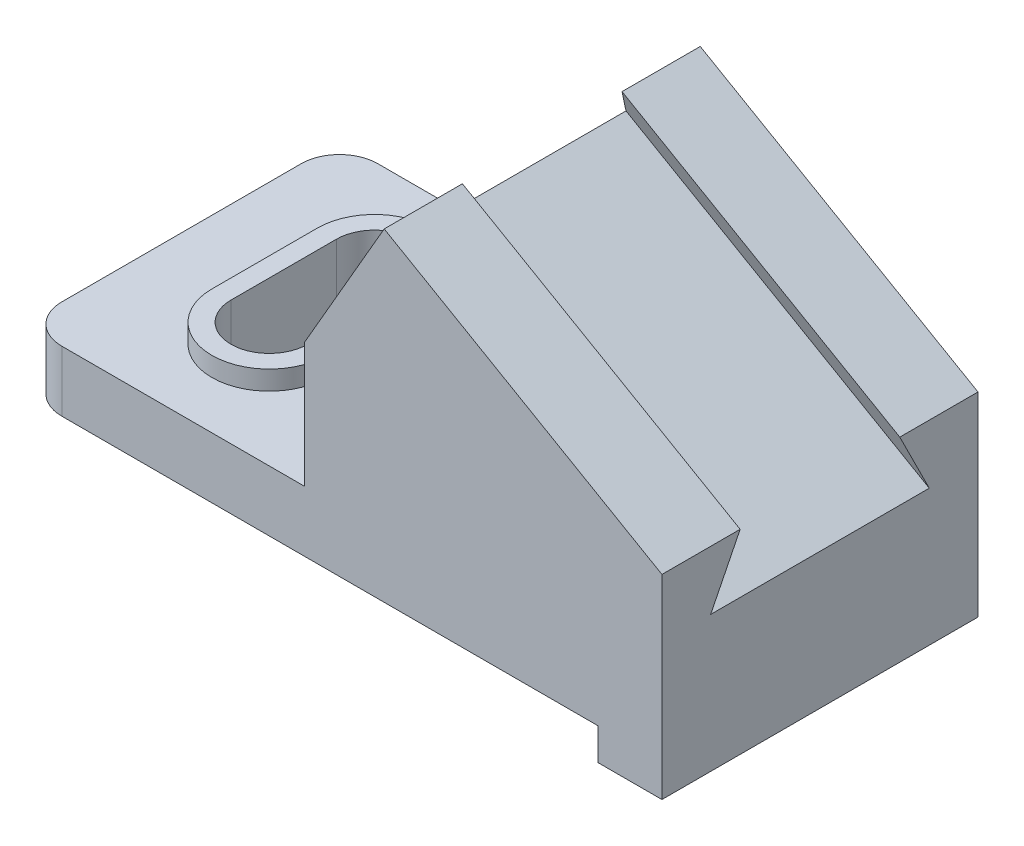
ISO-10303-21;
HEADER;
FILE_DESCRIPTION(('STEP AP214'),'2;1');
FILE_NAME('part.step','',(''),(''),'','','');
FILE_SCHEMA(('AUTOMOTIVE_DESIGN { 1 0 10303 214 1 1 1 1 }'));
ENDSEC;
DATA;
#1=APPLICATION_CONTEXT('core data for automotive mechanical design processes');
#2=APPLICATION_PROTOCOL_DEFINITION('international standard','automotive_design',2000,#1);
#3=PRODUCT_CONTEXT('',#1,'mechanical');
#4=PRODUCT('Part','Part','',(#3));
#5=PRODUCT_RELATED_PRODUCT_CATEGORY('part','',(#4));
#6=PRODUCT_DEFINITION_FORMATION('','',#4);
#7=PRODUCT_DEFINITION_CONTEXT('part definition',#1,'design');
#8=PRODUCT_DEFINITION('design','',#6,#7);
#9=PRODUCT_DEFINITION_SHAPE('','',#8);
#10=(LENGTH_UNIT() NAMED_UNIT(*) SI_UNIT(.MILLI.,.METRE.));
#11=(NAMED_UNIT(*) PLANE_ANGLE_UNIT() SI_UNIT($,.RADIAN.));
#12=(NAMED_UNIT(*) SI_UNIT($,.STERADIAN.) SOLID_ANGLE_UNIT());
#13=UNCERTAINTY_MEASURE_WITH_UNIT(LENGTH_MEASURE(1.E-05),#10,'distance_accuracy_value','');
#14=(GEOMETRIC_REPRESENTATION_CONTEXT(3) GLOBAL_UNCERTAINTY_ASSIGNED_CONTEXT((#13)) GLOBAL_UNIT_ASSIGNED_CONTEXT((#10,
#11,#12)) REPRESENTATION_CONTEXT('',''));
#15=CARTESIAN_POINT('',(0.,0.,0.));
#16=DIRECTION('',(0.,0.,1.));
#17=DIRECTION('',(1.,0.,0.));
#18=AXIS2_PLACEMENT_3D('',#15,#16,#17);
#19=CARTESIAN_POINT('',(56.5,55.6506350946109,24.75));
#20=DIRECTION('',(-0.5,-0.866025403784438,0.));
#21=DIRECTION('',(0.866025403784439,-0.5,0.));
#22=AXIS2_PLACEMENT_3D('',#19,#20,#21);
#23=PLANE('',#22);
#24=DIRECTION('',(0.,0.,-1.));
#25=VECTOR('',#24,1.);
#26=CARTESIAN_POINT('',(56.5,55.6506350946109,24.75));
#27=LINE('',#26,#25);
#28=CARTESIAN_POINT('',(56.5,55.6506350946109,-12.5));
#29=VERTEX_POINT('',#28);
#30=CARTESIAN_POINT('',(56.5,55.6506350946109,-24.75));
#31=VERTEX_POINT('',#30);
#32=EDGE_CURVE('E322',#29,#31,#27,.T.);
#33=ORIENTED_EDGE('',*,*,#32,.F.);
#34=DIRECTION('',(-0.866025403784439,0.5,0.));
#35=VECTOR('',#34,1.);
#36=CARTESIAN_POINT('',(113.222431864335,22.9019237886466,-12.5));
#37=LINE('',#36,#35);
#38=CARTESIAN_POINT('',(100.,30.5358983848622,-12.5));
#39=VERTEX_POINT('',#38);
#40=EDGE_CURVE('E221',#39,#29,#37,.T.);
#41=ORIENTED_EDGE('',*,*,#40,.F.);
#42=DIRECTION('',(0.,0.,-1.));
#43=VECTOR('',#42,1.);
#44=CARTESIAN_POINT('',(100.,30.5358983848622,24.75));
#45=LINE('',#44,#43);
#46=CARTESIAN_POINT('',(100.,30.5358983848622,-24.75));
#47=VERTEX_POINT('',#46);
#48=EDGE_CURVE('E324',#39,#47,#45,.T.);
#49=ORIENTED_EDGE('',*,*,#48,.T.);
#50=DIRECTION('',(-0.866025403784439,0.5,0.));
#51=VECTOR('',#50,1.);
#52=CARTESIAN_POINT('',(56.5,55.6506350946109,-24.75));
#53=LINE('',#52,#51);
#54=EDGE_CURVE('E309',#47,#31,#53,.T.);
#55=ORIENTED_EDGE('',*,*,#54,.T.);
#56=EDGE_LOOP('',(#33,#41,#49,#55));
#57=FACE_BOUND('',#56,.T.);
#58=ADVANCED_FACE('F33',(#57),#23,.F.);
#59=CARTESIAN_POINT('',(6.,14.5,24.75));
#60=DIRECTION('',(0.,-1.,0.));
#61=DIRECTION('',(0.,0.,-1.));
#62=AXIS2_PLACEMENT_3D('',#59,#60,#61);
#63=PLANE('',#62);
#64=DIRECTION('',(-1.,0.,0.));
#65=VECTOR('',#64,1.);
#66=CARTESIAN_POINT('',(6.,14.5,-24.75));
#67=LINE('',#66,#65);
#68=CARTESIAN_POINT('',(44.,14.5,-24.75));
#69=VERTEX_POINT('',#68);
#70=CARTESIAN_POINT('',(6.,14.5,-24.75));
#71=VERTEX_POINT('',#70);
#72=EDGE_CURVE('E284',#69,#71,#67,.T.);
#73=ORIENTED_EDGE('',*,*,#72,.T.);
#74=CARTESIAN_POINT('',(6.,14.5,-18.75));
#75=DIRECTION('',(0.,-1.,0.));
#76=DIRECTION('',(0.,0.,-1.));
#77=AXIS2_PLACEMENT_3D('',#74,#75,#76);
#78=CIRCLE('',#77,6.);
#79=CARTESIAN_POINT('',(0.,14.5,-18.75));
#80=VERTEX_POINT('',#79);
#81=EDGE_CURVE('E41',#71,#80,#78,.F.);
#82=ORIENTED_EDGE('',*,*,#81,.T.);
#83=DIRECTION('',(0.,0.,-1.));
#84=VECTOR('',#83,1.);
#85=CARTESIAN_POINT('',(0.,14.5,24.75));
#86=LINE('',#85,#84);
#87=CARTESIAN_POINT('',(0.,14.5,18.75));
#88=VERTEX_POINT('',#87);
#89=EDGE_CURVE('E340',#88,#80,#86,.T.);
#90=ORIENTED_EDGE('',*,*,#89,.F.);
#91=CARTESIAN_POINT('',(6.,14.5,18.75));
#92=DIRECTION('',(0.,-1.,0.));
#93=DIRECTION('',(0.,0.,-1.));
#94=AXIS2_PLACEMENT_3D('',#91,#92,#93);
#95=CIRCLE('',#94,6.);
#96=CARTESIAN_POINT('',(6.,14.5,24.75));
#97=VERTEX_POINT('',#96);
#98=EDGE_CURVE('E48',#88,#97,#95,.F.);
#99=ORIENTED_EDGE('',*,*,#98,.T.);
#100=DIRECTION('',(-1.,0.,0.));
#101=VECTOR('',#100,1.);
#102=CARTESIAN_POINT('',(0.,14.5,24.75));
#103=LINE('',#102,#101);
#104=CARTESIAN_POINT('',(44.,14.5,24.75));
#105=VERTEX_POINT('',#104);
#106=EDGE_CURVE('E281',#105,#97,#103,.T.);
#107=ORIENTED_EDGE('',*,*,#106,.F.);
#108=DIRECTION('',(0.,0.,-1.));
#109=VECTOR('',#108,1.);
#110=CARTESIAN_POINT('',(44.,14.5,24.75));
#111=LINE('',#110,#109);
#112=EDGE_CURVE('E299',#105,#69,#111,.T.);
#113=ORIENTED_EDGE('',*,*,#112,.T.);
#114=EDGE_LOOP('',(#73,#82,#90,#99,#107,#113));
#115=FACE_BOUND('',#114,.T.);
#116=CARTESIAN_POINT('',(22.,14.5,-8.25));
#117=DIRECTION('',(0.,1.,0.));
#118=DIRECTION('',(0.,0.,1.));
#119=AXIS2_PLACEMENT_3D('',#116,#117,#118);
#120=CIRCLE('',#119,9.);
#121=CARTESIAN_POINT('',(31.,14.5,-8.25));
#122=VERTEX_POINT('',#121);
#123=CARTESIAN_POINT('',(13.,14.5,-8.25));
#124=VERTEX_POINT('',#123);
#125=EDGE_CURVE('E247',#122,#124,#120,.T.);
#126=ORIENTED_EDGE('',*,*,#125,.F.);
#127=DIRECTION('',(0.,0.,-1.));
#128=VECTOR('',#127,1.);
#129=CARTESIAN_POINT('',(31.,14.5,-8.25));
#130=LINE('',#129,#128);
#131=CARTESIAN_POINT('',(31.,14.5,8.25));
#132=VERTEX_POINT('',#131);
#133=EDGE_CURVE('E252',#132,#122,#130,.T.);
#134=ORIENTED_EDGE('',*,*,#133,.F.);
#135=CARTESIAN_POINT('',(22.,14.5,8.25));
#136=DIRECTION('',(0.,1.,0.));
#137=DIRECTION('',(0.,0.,1.));
#138=AXIS2_PLACEMENT_3D('',#135,#136,#137);
#139=CIRCLE('',#138,9.);
#140=CARTESIAN_POINT('',(13.,14.5,8.25));
#141=VERTEX_POINT('',#140);
#142=EDGE_CURVE('E264',#141,#132,#139,.T.);
#143=ORIENTED_EDGE('',*,*,#142,.F.);
#144=DIRECTION('',(0.,0.,1.));
#145=VECTOR('',#144,1.);
#146=CARTESIAN_POINT('',(13.,14.5,-8.25));
#147=LINE('',#146,#145);
#148=EDGE_CURVE('E261',#124,#141,#147,.T.);
#149=ORIENTED_EDGE('',*,*,#148,.F.);
#150=EDGE_LOOP('',(#126,#134,#143,#149));
#151=FACE_BOUND('',#150,.T.);
#152=ADVANCED_FACE('F366',(#115,#151),#63,.F.);
#153=CARTESIAN_POINT('',(0.,5.,24.75));
#154=DIRECTION('',(1.,0.,0.));
#155=DIRECTION('',(0.,0.,-1.));
#156=AXIS2_PLACEMENT_3D('',#153,#154,#155);
#157=PLANE('',#156);
#158=ORIENTED_EDGE('',*,*,#89,.T.);
#159=DIRECTION('',(0.,-1.,0.));
#160=VECTOR('',#159,1.);
#161=CARTESIAN_POINT('',(0.,5.,-18.75));
#162=LINE('',#161,#160);
#163=CARTESIAN_POINT('',(0.,5.,-18.75));
#164=VERTEX_POINT('',#163);
#165=EDGE_CURVE('E357',#80,#164,#162,.T.);
#166=ORIENTED_EDGE('',*,*,#165,.T.);
#167=DIRECTION('',(0.,0.,-1.));
#168=VECTOR('',#167,1.);
#169=CARTESIAN_POINT('',(0.,5.,24.75));
#170=LINE('',#169,#168);
#171=CARTESIAN_POINT('',(0.,5.,18.75));
#172=VERTEX_POINT('',#171);
#173=EDGE_CURVE('E337',#172,#164,#170,.T.);
#174=ORIENTED_EDGE('',*,*,#173,.F.);
#175=DIRECTION('',(0.,-1.,0.));
#176=VECTOR('',#175,1.);
#177=CARTESIAN_POINT('',(0.,14.5,18.75));
#178=LINE('',#177,#176);
#179=EDGE_CURVE('E355',#172,#88,#178,.F.);
#180=ORIENTED_EDGE('',*,*,#179,.T.);
#181=EDGE_LOOP('',(#158,#166,#174,#180));
#182=FACE_BOUND('',#181,.T.);
#183=ADVANCED_FACE('F371',(#182),#157,.F.);
#184=CARTESIAN_POINT('',(90.,5.,24.75));
#185=DIRECTION('',(0.,1.,0.));
#186=DIRECTION('',(0.,0.,1.));
#187=AXIS2_PLACEMENT_3D('',#184,#185,#186);
#188=PLANE('',#187);
#189=DIRECTION('',(0.,0.,1.));
#190=VECTOR('',#189,1.);
#191=CARTESIAN_POINT('',(16.,5.,24.75));
#192=LINE('',#191,#190);
#193=CARTESIAN_POINT('',(16.,5.,-8.25));
#194=VERTEX_POINT('',#193);
#195=CARTESIAN_POINT('',(16.,5.,8.25));
#196=VERTEX_POINT('',#195);
#197=EDGE_CURVE('E349',#194,#196,#192,.T.);
#198=ORIENTED_EDGE('',*,*,#197,.T.);
#199=CARTESIAN_POINT('',(22.,5.,8.25));
#200=DIRECTION('',(0.,1.,0.));
#201=DIRECTION('',(0.,0.,1.));
#202=AXIS2_PLACEMENT_3D('',#199,#200,#201);
#203=CIRCLE('',#202,6.);
#204=CARTESIAN_POINT('',(28.,5.,8.25));
#205=VERTEX_POINT('',#204);
#206=EDGE_CURVE('E352',#196,#205,#203,.T.);
#207=ORIENTED_EDGE('',*,*,#206,.T.);
#208=DIRECTION('',(0.,0.,-1.));
#209=VECTOR('',#208,1.);
#210=CARTESIAN_POINT('',(28.,5.,24.75));
#211=LINE('',#210,#209);
#212=CARTESIAN_POINT('',(28.,5.,-8.25));
#213=VERTEX_POINT('',#212);
#214=EDGE_CURVE('E343',#205,#213,#211,.T.);
#215=ORIENTED_EDGE('',*,*,#214,.T.);
#216=CARTESIAN_POINT('',(22.,5.,-8.25));
#217=DIRECTION('',(0.,1.,0.));
#218=DIRECTION('',(0.,0.,1.));
#219=AXIS2_PLACEMENT_3D('',#216,#217,#218);
#220=CIRCLE('',#219,6.);
#221=EDGE_CURVE('E346',#213,#194,#220,.T.);
#222=ORIENTED_EDGE('',*,*,#221,.T.);
#223=EDGE_LOOP('',(#198,#207,#215,#222));
#224=FACE_BOUND('',#223,.T.);
#225=ORIENTED_EDGE('',*,*,#173,.T.);
#226=CARTESIAN_POINT('',(6.,5.,-18.75));
#227=DIRECTION('',(0.,1.,0.));
#228=DIRECTION('',(0.,0.,1.));
#229=AXIS2_PLACEMENT_3D('',#226,#227,#228);
#230=CIRCLE('',#229,6.);
#231=CARTESIAN_POINT('',(6.00000000000001,5.,-24.75));
#232=VERTEX_POINT('',#231);
#233=EDGE_CURVE('E362',#164,#232,#230,.F.);
#234=ORIENTED_EDGE('',*,*,#233,.T.);
#235=DIRECTION('',(1.,0.,0.));
#236=VECTOR('',#235,1.);
#237=CARTESIAN_POINT('',(90.,5.,-24.75));
#238=LINE('',#237,#236);
#239=CARTESIAN_POINT('',(90.,5.,-24.75));
#240=VERTEX_POINT('',#239);
#241=EDGE_CURVE('E280',#232,#240,#238,.T.);
#242=ORIENTED_EDGE('',*,*,#241,.T.);
#243=DIRECTION('',(0.,0.,-1.));
#244=VECTOR('',#243,1.);
#245=CARTESIAN_POINT('',(90.,5.,24.75));
#246=LINE('',#245,#244);
#247=CARTESIAN_POINT('',(90.,5.,24.75));
#248=VERTEX_POINT('',#247);
#249=EDGE_CURVE('E334',#248,#240,#246,.T.);
#250=ORIENTED_EDGE('',*,*,#249,.F.);
#251=DIRECTION('',(1.,0.,0.));
#252=VECTOR('',#251,1.);
#253=CARTESIAN_POINT('',(6.,5.,24.75));
#254=LINE('',#253,#252);
#255=CARTESIAN_POINT('',(6.,5.,24.75));
#256=VERTEX_POINT('',#255);
#257=EDGE_CURVE('E283',#256,#248,#254,.T.);
#258=ORIENTED_EDGE('',*,*,#257,.F.);
#259=CARTESIAN_POINT('',(6.,5.,18.75));
#260=DIRECTION('',(0.,1.,0.));
#261=DIRECTION('',(0.,0.,1.));
#262=AXIS2_PLACEMENT_3D('',#259,#260,#261);
#263=CIRCLE('',#262,6.);
#264=EDGE_CURVE('E360',#256,#172,#263,.F.);
#265=ORIENTED_EDGE('',*,*,#264,.T.);
#266=EDGE_LOOP('',(#225,#234,#242,#250,#258,#265));
#267=FACE_BOUND('',#266,.T.);
#268=ADVANCED_FACE('F376',(#224,#267),#188,.F.);
#269=CARTESIAN_POINT('',(90.,0.,24.75));
#270=DIRECTION('',(1.,0.,0.));
#271=DIRECTION('',(0.,0.,-1.));
#272=AXIS2_PLACEMENT_3D('',#269,#270,#271);
#273=PLANE('',#272);
#274=DIRECTION('',(0.,-1.,0.));
#275=VECTOR('',#274,1.);
#276=CARTESIAN_POINT('',(90.,0.,-24.75));
#277=LINE('',#276,#275);
#278=CARTESIAN_POINT('',(90.,0.,-24.75));
#279=VERTEX_POINT('',#278);
#280=EDGE_CURVE('E301',#240,#279,#277,.T.);
#281=ORIENTED_EDGE('',*,*,#280,.T.);
#282=DIRECTION('',(0.,0.,-1.));
#283=VECTOR('',#282,1.);
#284=CARTESIAN_POINT('',(90.,0.,24.75));
#285=LINE('',#284,#283);
#286=CARTESIAN_POINT('',(90.,0.,24.75));
#287=VERTEX_POINT('',#286);
#288=EDGE_CURVE('E331',#287,#279,#285,.T.);
#289=ORIENTED_EDGE('',*,*,#288,.F.);
#290=DIRECTION('',(0.,-1.,0.));
#291=VECTOR('',#290,1.);
#292=CARTESIAN_POINT('',(90.,0.,24.75));
#293=LINE('',#292,#291);
#294=EDGE_CURVE('E286',#248,#287,#293,.T.);
#295=ORIENTED_EDGE('',*,*,#294,.F.);
#296=ORIENTED_EDGE('',*,*,#249,.T.);
#297=EDGE_LOOP('',(#281,#289,#295,#296));
#298=FACE_BOUND('',#297,.T.);
#299=ADVANCED_FACE('F383',(#298),#273,.F.);
#300=CARTESIAN_POINT('',(90.,0.,24.75));
#301=DIRECTION('',(0.,1.,0.));
#302=DIRECTION('',(0.,0.,1.));
#303=AXIS2_PLACEMENT_3D('',#300,#301,#302);
#304=PLANE('',#303);
#305=DIRECTION('',(1.,0.,0.));
#306=VECTOR('',#305,1.);
#307=CARTESIAN_POINT('',(90.,0.,-24.75));
#308=LINE('',#307,#306);
#309=CARTESIAN_POINT('',(100.,0.,-24.75));
#310=VERTEX_POINT('',#309);
#311=EDGE_CURVE('E303',#279,#310,#308,.T.);
#312=ORIENTED_EDGE('',*,*,#311,.T.);
#313=DIRECTION('',(0.,0.,-1.));
#314=VECTOR('',#313,1.);
#315=CARTESIAN_POINT('',(100.,0.,24.75));
#316=LINE('',#315,#314);
#317=CARTESIAN_POINT('',(100.,0.,24.75));
#318=VERTEX_POINT('',#317);
#319=EDGE_CURVE('E328',#318,#310,#316,.T.);
#320=ORIENTED_EDGE('',*,*,#319,.F.);
#321=DIRECTION('',(1.,0.,0.));
#322=VECTOR('',#321,1.);
#323=CARTESIAN_POINT('',(90.,0.,24.75));
#324=LINE('',#323,#322);
#325=EDGE_CURVE('E288',#287,#318,#324,.T.);
#326=ORIENTED_EDGE('',*,*,#325,.F.);
#327=ORIENTED_EDGE('',*,*,#288,.T.);
#328=EDGE_LOOP('',(#312,#320,#326,#327));
#329=FACE_BOUND('',#328,.T.);
#330=ADVANCED_FACE('F387',(#329),#304,.F.);
#331=CARTESIAN_POINT('',(100.,30.5358983848622,24.75));
#332=DIRECTION('',(-1.,0.,0.));
#333=DIRECTION('',(0.,0.,1.));
#334=AXIS2_PLACEMENT_3D('',#331,#332,#333);
#335=PLANE('',#334);
#336=ORIENTED_EDGE('',*,*,#48,.F.);
#337=DIRECTION('',(0.,-0.894427190999914,-0.447213595499962));
#338=VECTOR('',#337,1.);
#339=CARTESIAN_POINT('',(100.,45.4358983848623,-5.04999999999988));
#340=LINE('',#339,#338);
#341=CARTESIAN_POINT('',(100.,21.2982940778282,-17.1188021535171));
#342=VERTEX_POINT('',#341);
#343=EDGE_CURVE('E227',#39,#342,#340,.T.);
#344=ORIENTED_EDGE('',*,*,#343,.T.);
#345=DIRECTION('',(0.,0.,1.));
#346=VECTOR('',#345,1.);
#347=CARTESIAN_POINT('',(100.,21.2982940778282,24.75));
#348=LINE('',#347,#346);
#349=CARTESIAN_POINT('',(100.,21.2982940778282,17.118802153517));
#350=VERTEX_POINT('',#349);
#351=EDGE_CURVE('E223',#342,#350,#348,.T.);
#352=ORIENTED_EDGE('',*,*,#351,.T.);
#353=DIRECTION('',(0.,0.894427190999914,-0.447213595499961));
#354=VECTOR('',#353,1.);
#355=CARTESIAN_POINT('',(100.,25.6358983848621,14.95));
#356=LINE('',#355,#354);
#357=CARTESIAN_POINT('',(100.,30.5358983848622,12.5));
#358=VERTEX_POINT('',#357);
#359=EDGE_CURVE('E197',#350,#358,#356,.T.);
#360=ORIENTED_EDGE('',*,*,#359,.T.);
#361=CARTESIAN_POINT('',(100.,30.5358983848622,24.75));
#362=VERTEX_POINT('',#361);
#363=EDGE_CURVE('E325',#362,#358,#45,.T.);
#364=ORIENTED_EDGE('',*,*,#363,.F.);
#365=DIRECTION('',(0.,1.,0.));
#366=VECTOR('',#365,1.);
#367=CARTESIAN_POINT('',(100.,0.,24.75));
#368=LINE('',#367,#366);
#369=EDGE_CURVE('E290',#318,#362,#368,.T.);
#370=ORIENTED_EDGE('',*,*,#369,.F.);
#371=ORIENTED_EDGE('',*,*,#319,.T.);
#372=DIRECTION('',(0.,1.,0.));
#373=VECTOR('',#372,1.);
#374=CARTESIAN_POINT('',(100.,30.5358983848622,-24.75));
#375=LINE('',#374,#373);
#376=EDGE_CURVE('E306',#310,#47,#375,.T.);
#377=ORIENTED_EDGE('',*,*,#376,.T.);
#378=EDGE_LOOP('',(#336,#344,#352,#360,#364,#370,#371,#377));
#379=FACE_BOUND('',#378,.T.);
#380=ADVANCED_FACE('F412',(#379),#335,.F.);
#381=ORIENTED_EDGE('',*,*,#363,.T.);
#382=DIRECTION('',(-0.866025403784439,0.5,0.));
#383=VECTOR('',#382,1.);
#384=CARTESIAN_POINT('',(113.222431864335,22.9019237886466,12.5));
#385=LINE('',#384,#383);
#386=CARTESIAN_POINT('',(56.5,55.6506350946109,12.5));
#387=VERTEX_POINT('',#386);
#388=EDGE_CURVE('E200',#358,#387,#385,.T.);
#389=ORIENTED_EDGE('',*,*,#388,.T.);
#390=CARTESIAN_POINT('',(56.5,55.6506350946109,24.75));
#391=VERTEX_POINT('',#390);
#392=EDGE_CURVE('E216',#391,#387,#27,.T.);
#393=ORIENTED_EDGE('',*,*,#392,.F.);
#394=DIRECTION('',(-0.866025403784439,0.5,0.));
#395=VECTOR('',#394,1.);
#396=CARTESIAN_POINT('',(56.5,55.6506350946109,24.75));
#397=LINE('',#396,#395);
#398=EDGE_CURVE('E292',#362,#391,#397,.T.);
#399=ORIENTED_EDGE('',*,*,#398,.F.);
#400=EDGE_LOOP('',(#381,#389,#393,#399));
#401=FACE_BOUND('',#400,.T.);
#402=ADVANCED_FACE('F403',(#401),#23,.F.);
#403=CARTESIAN_POINT('',(44.,34.,24.75));
#404=DIRECTION('',(0.866025403784439,-0.5,0.));
#405=DIRECTION('',(0.5,0.866025403784439,0.));
#406=AXIS2_PLACEMENT_3D('',#403,#404,#405);
#407=PLANE('',#406);
#408=DIRECTION('',(0.,0.,1.));
#409=VECTOR('',#408,1.);
#410=CARTESIAN_POINT('',(52.5,48.7224318643354,-17.1188021535171));
#411=LINE('',#410,#409);
#412=CARTESIAN_POINT('',(52.5,48.7224318643354,-17.1188021535171));
#413=VERTEX_POINT('',#412);
#414=CARTESIAN_POINT('',(52.5,48.7224318643354,17.118802153517));
#415=VERTEX_POINT('',#414);
#416=EDGE_CURVE('E205',#413,#415,#411,.T.);
#417=ORIENTED_EDGE('',*,*,#416,.F.);
#418=DIRECTION('',(-0.433012701892218,-0.749999999999998,-0.500000000000004));
#419=VECTOR('',#418,1.);
#420=CARTESIAN_POINT('',(56.5,55.6506350946109,-12.5));
#421=LINE('',#420,#419);
#422=EDGE_CURVE('E210',#29,#413,#421,.T.);
#423=ORIENTED_EDGE('',*,*,#422,.F.);
#424=ORIENTED_EDGE('',*,*,#32,.T.);
#425=DIRECTION('',(-0.5,-0.866025403784439,0.));
#426=VECTOR('',#425,1.);
#427=CARTESIAN_POINT('',(44.,34.,-24.75));
#428=LINE('',#427,#426);
#429=CARTESIAN_POINT('',(44.,34.,-24.75));
#430=VERTEX_POINT('',#429);
#431=EDGE_CURVE('E312',#31,#430,#428,.T.);
#432=ORIENTED_EDGE('',*,*,#431,.T.);
#433=DIRECTION('',(0.,0.,-1.));
#434=VECTOR('',#433,1.);
#435=CARTESIAN_POINT('',(44.,34.,24.75));
#436=LINE('',#435,#434);
#437=CARTESIAN_POINT('',(44.,34.,24.75));
#438=VERTEX_POINT('',#437);
#439=EDGE_CURVE('E319',#438,#430,#436,.T.);
#440=ORIENTED_EDGE('',*,*,#439,.F.);
#441=DIRECTION('',(-0.5,-0.866025403784439,0.));
#442=VECTOR('',#441,1.);
#443=CARTESIAN_POINT('',(44.,34.,24.75));
#444=LINE('',#443,#442);
#445=EDGE_CURVE('E294',#391,#438,#444,.T.);
#446=ORIENTED_EDGE('',*,*,#445,.F.);
#447=ORIENTED_EDGE('',*,*,#392,.T.);
#448=DIRECTION('',(0.433012701892218,0.749999999999998,-0.500000000000004));
#449=VECTOR('',#448,1.);
#450=CARTESIAN_POINT('',(56.5,55.6506350946109,12.5));
#451=LINE('',#450,#449);
#452=EDGE_CURVE('E194',#415,#387,#451,.T.);
#453=ORIENTED_EDGE('',*,*,#452,.F.);
#454=EDGE_LOOP('',(#417,#423,#424,#432,#440,#446,#447,#453));
#455=FACE_BOUND('',#454,.T.);
#456=ADVANCED_FACE('F213',(#455),#407,.F.);
#457=CARTESIAN_POINT('',(44.,14.5,24.75));
#458=DIRECTION('',(1.,0.,0.));
#459=DIRECTION('',(0.,0.,-1.));
#460=AXIS2_PLACEMENT_3D('',#457,#458,#459);
#461=PLANE('',#460);
#462=DIRECTION('',(0.,-1.,0.));
#463=VECTOR('',#462,1.);
#464=CARTESIAN_POINT('',(44.,14.5,-24.75));
#465=LINE('',#464,#463);
#466=EDGE_CURVE('E314',#430,#69,#465,.T.);
#467=ORIENTED_EDGE('',*,*,#466,.T.);
#468=ORIENTED_EDGE('',*,*,#112,.F.);
#469=DIRECTION('',(0.,-1.,0.));
#470=VECTOR('',#469,1.);
#471=CARTESIAN_POINT('',(44.,14.5,24.75));
#472=LINE('',#471,#470);
#473=EDGE_CURVE('E296',#438,#105,#472,.T.);
#474=ORIENTED_EDGE('',*,*,#473,.F.);
#475=ORIENTED_EDGE('',*,*,#439,.T.);
#476=EDGE_LOOP('',(#467,#468,#474,#475));
#477=FACE_BOUND('',#476,.T.);
#478=ADVANCED_FACE('F418',(#477),#461,.F.);
#479=CARTESIAN_POINT('',(0.,0.,24.75));
#480=DIRECTION('',(0.,0.,1.));
#481=DIRECTION('',(1.,0.,0.));
#482=AXIS2_PLACEMENT_3D('',#479,#480,#481);
#483=PLANE('',#482);
#484=ORIENTED_EDGE('',*,*,#106,.T.);
#485=DIRECTION('',(0.,-1.,0.));
#486=VECTOR('',#485,1.);
#487=CARTESIAN_POINT('',(6.,5.,24.75));
#488=LINE('',#487,#486);
#489=EDGE_CURVE('E11',#97,#256,#488,.T.);
#490=ORIENTED_EDGE('',*,*,#489,.T.);
#491=ORIENTED_EDGE('',*,*,#257,.T.);
#492=ORIENTED_EDGE('',*,*,#294,.T.);
#493=ORIENTED_EDGE('',*,*,#325,.T.);
#494=ORIENTED_EDGE('',*,*,#369,.T.);
#495=ORIENTED_EDGE('',*,*,#398,.T.);
#496=ORIENTED_EDGE('',*,*,#445,.T.);
#497=ORIENTED_EDGE('',*,*,#473,.T.);
#498=EDGE_LOOP('',(#484,#490,#491,#492,#493,#494,#495,#496,#497));
#499=FACE_BOUND('',#498,.T.);
#500=ADVANCED_FACE('F391',(#499),#483,.T.);
#501=CARTESIAN_POINT('',(0.,0.,-24.75));
#502=DIRECTION('',(0.,0.,1.));
#503=DIRECTION('',(1.,0.,0.));
#504=AXIS2_PLACEMENT_3D('',#501,#502,#503);
#505=PLANE('',#504);
#506=ORIENTED_EDGE('',*,*,#241,.F.);
#507=DIRECTION('',(0.,-1.,0.));
#508=VECTOR('',#507,1.);
#509=CARTESIAN_POINT('',(6.,0.,-24.75));
#510=LINE('',#509,#508);
#511=EDGE_CURVE('E56',#232,#71,#510,.F.);
#512=ORIENTED_EDGE('',*,*,#511,.T.);
#513=ORIENTED_EDGE('',*,*,#72,.F.);
#514=ORIENTED_EDGE('',*,*,#466,.F.);
#515=ORIENTED_EDGE('',*,*,#431,.F.);
#516=ORIENTED_EDGE('',*,*,#54,.F.);
#517=ORIENTED_EDGE('',*,*,#376,.F.);
#518=ORIENTED_EDGE('',*,*,#311,.F.);
#519=ORIENTED_EDGE('',*,*,#280,.F.);
#520=EDGE_LOOP('',(#506,#512,#513,#514,#515,#516,#517,#518,#519));
#521=FACE_BOUND('',#520,.T.);
#522=ADVANCED_FACE('F379',(#521),#505,.F.);
#523=CARTESIAN_POINT('',(22.,17.5,-8.25));
#524=DIRECTION('',(0.,1.,0.));
#525=DIRECTION('',(0.,0.,1.));
#526=AXIS2_PLACEMENT_3D('',#523,#524,#525);
#527=PLANE('',#526);
#528=CARTESIAN_POINT('',(22.,17.5,-8.25));
#529=DIRECTION('',(0.,1.,0.));
#530=DIRECTION('',(0.,0.,1.));
#531=AXIS2_PLACEMENT_3D('',#528,#529,#530);
#532=CIRCLE('',#531,9.);
#533=CARTESIAN_POINT('',(31.,17.5,-8.25));
#534=VERTEX_POINT('',#533);
#535=CARTESIAN_POINT('',(13.,17.5,-8.25));
#536=VERTEX_POINT('',#535);
#537=EDGE_CURVE('E248',#534,#536,#532,.T.);
#538=ORIENTED_EDGE('',*,*,#537,.T.);
#539=DIRECTION('',(0.,0.,1.));
#540=VECTOR('',#539,1.);
#541=CARTESIAN_POINT('',(13.,17.5,-8.25));
#542=LINE('',#541,#540);
#543=CARTESIAN_POINT('',(13.,17.5,8.25));
#544=VERTEX_POINT('',#543);
#545=EDGE_CURVE('E251',#536,#544,#542,.T.);
#546=ORIENTED_EDGE('',*,*,#545,.T.);
#547=CARTESIAN_POINT('',(22.,17.5,8.25));
#548=DIRECTION('',(0.,1.,0.));
#549=DIRECTION('',(0.,0.,1.));
#550=AXIS2_PLACEMENT_3D('',#547,#548,#549);
#551=CIRCLE('',#550,9.);
#552=CARTESIAN_POINT('',(31.,17.5,8.25));
#553=VERTEX_POINT('',#552);
#554=EDGE_CURVE('E254',#544,#553,#551,.T.);
#555=ORIENTED_EDGE('',*,*,#554,.T.);
#556=DIRECTION('',(0.,0.,-1.));
#557=VECTOR('',#556,1.);
#558=CARTESIAN_POINT('',(31.,17.5,-8.25));
#559=LINE('',#558,#557);
#560=EDGE_CURVE('E256',#553,#534,#559,.T.);
#561=ORIENTED_EDGE('',*,*,#560,.T.);
#562=EDGE_LOOP('',(#538,#546,#555,#561));
#563=FACE_BOUND('',#562,.T.);
#564=DIRECTION('',(0.,0.,1.));
#565=VECTOR('',#564,1.);
#566=CARTESIAN_POINT('',(16.,17.5,-8.25));
#567=LINE('',#566,#565);
#568=CARTESIAN_POINT('',(16.,17.5,-8.25));
#569=VERTEX_POINT('',#568);
#570=CARTESIAN_POINT('',(16.,17.5,8.25));
#571=VERTEX_POINT('',#570);
#572=EDGE_CURVE('E232',#569,#571,#567,.T.);
#573=ORIENTED_EDGE('',*,*,#572,.F.);
#574=CARTESIAN_POINT('',(22.,17.5,-8.25));
#575=DIRECTION('',(0.,1.,0.));
#576=DIRECTION('',(0.,0.,1.));
#577=AXIS2_PLACEMENT_3D('',#574,#575,#576);
#578=CIRCLE('',#577,6.);
#579=CARTESIAN_POINT('',(28.,17.5,-8.25));
#580=VERTEX_POINT('',#579);
#581=EDGE_CURVE('E230',#580,#569,#578,.T.);
#582=ORIENTED_EDGE('',*,*,#581,.F.);
#583=DIRECTION('',(0.,0.,-1.));
#584=VECTOR('',#583,1.);
#585=CARTESIAN_POINT('',(28.,17.5,-8.25));
#586=LINE('',#585,#584);
#587=CARTESIAN_POINT('',(28.,17.5,8.24999999999999));
#588=VERTEX_POINT('',#587);
#589=EDGE_CURVE('E237',#588,#580,#586,.T.);
#590=ORIENTED_EDGE('',*,*,#589,.F.);
#591=CARTESIAN_POINT('',(22.,17.5,8.25));
#592=DIRECTION('',(0.,1.,0.));
#593=DIRECTION('',(0.,0.,1.));
#594=AXIS2_PLACEMENT_3D('',#591,#592,#593);
#595=CIRCLE('',#594,6.);
#596=EDGE_CURVE('E234',#571,#588,#595,.T.);
#597=ORIENTED_EDGE('',*,*,#596,.F.);
#598=EDGE_LOOP('',(#573,#582,#590,#597));
#599=FACE_BOUND('',#598,.T.);
#600=ADVANCED_FACE('F440',(#563,#599),#527,.T.);
#601=CARTESIAN_POINT('',(22.,17.5,-8.25));
#602=DIRECTION('',(0.,-1.,0.));
#603=DIRECTION('',(0.,0.,-1.));
#604=AXIS2_PLACEMENT_3D('',#601,#602,#603);
#605=CYLINDRICAL_SURFACE('',#604,9.);
#606=ORIENTED_EDGE('',*,*,#125,.T.);
#607=DIRECTION('',(0.,-1.,0.));
#608=VECTOR('',#607,1.);
#609=CARTESIAN_POINT('',(13.,17.5,-8.25));
#610=LINE('',#609,#608);
#611=EDGE_CURVE('E277',#536,#124,#610,.T.);
#612=ORIENTED_EDGE('',*,*,#611,.F.);
#613=ORIENTED_EDGE('',*,*,#537,.F.);
#614=DIRECTION('',(0.,-1.,0.));
#615=VECTOR('',#614,1.);
#616=CARTESIAN_POINT('',(31.,17.5,-8.25));
#617=LINE('',#616,#615);
#618=EDGE_CURVE('E258',#534,#122,#617,.T.);
#619=ORIENTED_EDGE('',*,*,#618,.T.);
#620=EDGE_LOOP('',(#606,#612,#613,#619));
#621=FACE_BOUND('',#620,.T.);
#622=ADVANCED_FACE('F442',(#621),#605,.T.);
#623=CARTESIAN_POINT('',(13.,17.5,-8.25));
#624=DIRECTION('',(1.,0.,0.));
#625=DIRECTION('',(0.,0.,-1.));
#626=AXIS2_PLACEMENT_3D('',#623,#624,#625);
#627=PLANE('',#626);
#628=ORIENTED_EDGE('',*,*,#148,.T.);
#629=DIRECTION('',(0.,-1.,0.));
#630=VECTOR('',#629,1.);
#631=CARTESIAN_POINT('',(13.,17.5,8.25));
#632=LINE('',#631,#630);
#633=EDGE_CURVE('E274',#544,#141,#632,.T.);
#634=ORIENTED_EDGE('',*,*,#633,.F.);
#635=ORIENTED_EDGE('',*,*,#545,.F.);
#636=ORIENTED_EDGE('',*,*,#611,.T.);
#637=EDGE_LOOP('',(#628,#634,#635,#636));
#638=FACE_BOUND('',#637,.T.);
#639=ADVANCED_FACE('F445',(#638),#627,.F.);
#640=CARTESIAN_POINT('',(22.,17.5,8.25));
#641=DIRECTION('',(0.,-1.,0.));
#642=DIRECTION('',(0.,0.,-1.));
#643=AXIS2_PLACEMENT_3D('',#640,#641,#642);
#644=CYLINDRICAL_SURFACE('',#643,9.);
#645=ORIENTED_EDGE('',*,*,#142,.T.);
#646=DIRECTION('',(0.,-1.,0.));
#647=VECTOR('',#646,1.);
#648=CARTESIAN_POINT('',(31.,17.5,8.25));
#649=LINE('',#648,#647);
#650=EDGE_CURVE('E271',#553,#132,#649,.T.);
#651=ORIENTED_EDGE('',*,*,#650,.F.);
#652=ORIENTED_EDGE('',*,*,#554,.F.);
#653=ORIENTED_EDGE('',*,*,#633,.T.);
#654=EDGE_LOOP('',(#645,#651,#652,#653));
#655=FACE_BOUND('',#654,.T.);
#656=ADVANCED_FACE('F449',(#655),#644,.T.);
#657=CARTESIAN_POINT('',(31.,17.5,-8.25));
#658=DIRECTION('',(-1.,0.,0.));
#659=DIRECTION('',(0.,0.,1.));
#660=AXIS2_PLACEMENT_3D('',#657,#658,#659);
#661=PLANE('',#660);
#662=ORIENTED_EDGE('',*,*,#133,.T.);
#663=ORIENTED_EDGE('',*,*,#618,.F.);
#664=ORIENTED_EDGE('',*,*,#560,.F.);
#665=ORIENTED_EDGE('',*,*,#650,.T.);
#666=EDGE_LOOP('',(#662,#663,#664,#665));
#667=FACE_BOUND('',#666,.T.);
#668=ADVANCED_FACE('F453',(#667),#661,.F.);
#669=CARTESIAN_POINT('',(22.,17.5,-8.25));
#670=DIRECTION('',(0.,-1.,0.));
#671=DIRECTION('',(0.,0.,-1.));
#672=AXIS2_PLACEMENT_3D('',#669,#670,#671);
#673=CYLINDRICAL_SURFACE('',#672,6.);
#674=DIRECTION('',(0.,-1.,0.));
#675=VECTOR('',#674,1.);
#676=CARTESIAN_POINT('',(16.,17.5,-8.25));
#677=LINE('',#676,#675);
#678=EDGE_CURVE('E245',#569,#194,#677,.T.);
#679=ORIENTED_EDGE('',*,*,#678,.T.);
#680=ORIENTED_EDGE('',*,*,#221,.F.);
#681=DIRECTION('',(0.,-1.,0.));
#682=VECTOR('',#681,1.);
#683=CARTESIAN_POINT('',(28.,17.5,-8.25));
#684=LINE('',#683,#682);
#685=EDGE_CURVE('E239',#580,#213,#684,.T.);
#686=ORIENTED_EDGE('',*,*,#685,.F.);
#687=ORIENTED_EDGE('',*,*,#581,.T.);
#688=EDGE_LOOP('',(#679,#680,#686,#687));
#689=FACE_BOUND('',#688,.T.);
#690=ADVANCED_FACE('F457',(#689),#673,.F.);
#691=CARTESIAN_POINT('',(16.,17.5,-8.25));
#692=DIRECTION('',(1.,0.,0.));
#693=DIRECTION('',(0.,0.,-1.));
#694=AXIS2_PLACEMENT_3D('',#691,#692,#693);
#695=PLANE('',#694);
#696=DIRECTION('',(0.,-1.,0.));
#697=VECTOR('',#696,1.);
#698=CARTESIAN_POINT('',(16.,17.5,8.25));
#699=LINE('',#698,#697);
#700=EDGE_CURVE('E243',#571,#196,#699,.T.);
#701=ORIENTED_EDGE('',*,*,#700,.T.);
#702=ORIENTED_EDGE('',*,*,#197,.F.);
#703=ORIENTED_EDGE('',*,*,#678,.F.);
#704=ORIENTED_EDGE('',*,*,#572,.T.);
#705=EDGE_LOOP('',(#701,#702,#703,#704));
#706=FACE_BOUND('',#705,.T.);
#707=ADVANCED_FACE('F464',(#706),#695,.T.);
#708=CARTESIAN_POINT('',(22.,17.5,8.25));
#709=DIRECTION('',(0.,-1.,0.));
#710=DIRECTION('',(0.,0.,-1.));
#711=AXIS2_PLACEMENT_3D('',#708,#709,#710);
#712=CYLINDRICAL_SURFACE('',#711,6.);
#713=DIRECTION('',(0.,-1.,0.));
#714=VECTOR('',#713,1.);
#715=CARTESIAN_POINT('',(28.,17.5,8.25));
#716=LINE('',#715,#714);
#717=EDGE_CURVE('E241',#588,#205,#716,.T.);
#718=ORIENTED_EDGE('',*,*,#717,.T.);
#719=ORIENTED_EDGE('',*,*,#206,.F.);
#720=ORIENTED_EDGE('',*,*,#700,.F.);
#721=ORIENTED_EDGE('',*,*,#596,.T.);
#722=EDGE_LOOP('',(#718,#719,#720,#721));
#723=FACE_BOUND('',#722,.T.);
#724=ADVANCED_FACE('F468',(#723),#712,.F.);
#725=CARTESIAN_POINT('',(28.,17.5,-8.25));
#726=DIRECTION('',(-1.,0.,0.));
#727=DIRECTION('',(0.,0.,1.));
#728=AXIS2_PLACEMENT_3D('',#725,#726,#727);
#729=PLANE('',#728);
#730=ORIENTED_EDGE('',*,*,#685,.T.);
#731=ORIENTED_EDGE('',*,*,#214,.F.);
#732=ORIENTED_EDGE('',*,*,#717,.F.);
#733=ORIENTED_EDGE('',*,*,#589,.T.);
#734=EDGE_LOOP('',(#730,#731,#732,#733));
#735=FACE_BOUND('',#734,.T.);
#736=ADVANCED_FACE('F472',(#735),#729,.T.);
#737=CARTESIAN_POINT('',(113.222431864335,22.9019237886466,-12.5));
#738=DIRECTION('',(0.250000000000002,0.433012701892223,-0.866025403784436));
#739=DIRECTION('',(0.,0.894427190999914,0.447213595499962));
#740=AXIS2_PLACEMENT_3D('',#737,#738,#739);
#741=PLANE('',#740);
#742=ORIENTED_EDGE('',*,*,#40,.T.);
#743=ORIENTED_EDGE('',*,*,#422,.T.);
#744=DIRECTION('',(-0.866025403784439,0.5,0.));
#745=VECTOR('',#744,1.);
#746=CARTESIAN_POINT('',(109.222431864335,15.9737205583711,-17.1188021535171));
#747=LINE('',#746,#745);
#748=EDGE_CURVE('E201',#342,#413,#747,.T.);
#749=ORIENTED_EDGE('',*,*,#748,.F.);
#750=ORIENTED_EDGE('',*,*,#343,.F.);
#751=EDGE_LOOP('',(#742,#743,#749,#750));
#752=FACE_BOUND('',#751,.T.);
#753=ADVANCED_FACE('F423',(#752),#741,.F.);
#754=CARTESIAN_POINT('',(113.222431864335,22.9019237886466,12.5));
#755=DIRECTION('',(0.250000000000002,0.433012701892222,0.866025403784437));
#756=DIRECTION('',(0.,-0.894427190999914,0.447213595499961));
#757=AXIS2_PLACEMENT_3D('',#754,#755,#756);
#758=PLANE('',#757);
#759=DIRECTION('',(-0.866025403784439,0.5,0.));
#760=VECTOR('',#759,1.);
#761=CARTESIAN_POINT('',(109.222431864335,15.9737205583711,17.118802153517));
#762=LINE('',#761,#760);
#763=EDGE_CURVE('E190',#350,#415,#762,.T.);
#764=ORIENTED_EDGE('',*,*,#763,.T.);
#765=ORIENTED_EDGE('',*,*,#452,.T.);
#766=ORIENTED_EDGE('',*,*,#388,.F.);
#767=ORIENTED_EDGE('',*,*,#359,.F.);
#768=EDGE_LOOP('',(#764,#765,#766,#767));
#769=FACE_BOUND('',#768,.T.);
#770=ADVANCED_FACE('F192',(#769),#758,.F.);
#771=CARTESIAN_POINT('',(109.222431864335,15.9737205583711,-17.1188021535171));
#772=DIRECTION('',(-0.5,-0.866025403784439,0.));
#773=DIRECTION('',(0.866025403784439,-0.5,0.));
#774=AXIS2_PLACEMENT_3D('',#771,#772,#773);
#775=PLANE('',#774);
#776=ORIENTED_EDGE('',*,*,#748,.T.);
#777=ORIENTED_EDGE('',*,*,#416,.T.);
#778=ORIENTED_EDGE('',*,*,#763,.F.);
#779=ORIENTED_EDGE('',*,*,#351,.F.);
#780=EDGE_LOOP('',(#776,#777,#778,#779));
#781=FACE_BOUND('',#780,.T.);
#782=ADVANCED_FACE('F206',(#781),#775,.F.);
#783=CARTESIAN_POINT('',(6.,5.,-18.75));
#784=DIRECTION('',(0.,-1.,0.));
#785=DIRECTION('',(0.,0.,-1.));
#786=AXIS2_PLACEMENT_3D('',#783,#784,#785);
#787=CYLINDRICAL_SURFACE('',#786,6.);
#788=ORIENTED_EDGE('',*,*,#81,.F.);
#789=ORIENTED_EDGE('',*,*,#511,.F.);
#790=ORIENTED_EDGE('',*,*,#233,.F.);
#791=ORIENTED_EDGE('',*,*,#165,.F.);
#792=EDGE_LOOP('',(#788,#789,#790,#791));
#793=FACE_BOUND('',#792,.T.);
#794=ADVANCED_FACE('F374',(#793),#787,.T.);
#795=CARTESIAN_POINT('',(6.,0.,18.75));
#796=DIRECTION('',(0.,1.,0.));
#797=DIRECTION('',(0.,0.,1.));
#798=AXIS2_PLACEMENT_3D('',#795,#796,#797);
#799=CYLINDRICAL_SURFACE('',#798,6.);
#800=ORIENTED_EDGE('',*,*,#98,.F.);
#801=ORIENTED_EDGE('',*,*,#179,.F.);
#802=ORIENTED_EDGE('',*,*,#264,.F.);
#803=ORIENTED_EDGE('',*,*,#489,.F.);
#804=EDGE_LOOP('',(#800,#801,#802,#803));
#805=FACE_BOUND('',#804,.T.);
#806=ADVANCED_FACE('F35',(#805),#799,.T.);
#807=CLOSED_SHELL('',(#58,#152,#183,#268,#299,#330,#380,#402,#456,#478,#500,#522,#600,#622,#639,
#656,#668,#690,#707,#724,#736,#753,#770,#782,#794,#806));
#808=MANIFOLD_SOLID_BREP('B2',#807);
#809=ADVANCED_BREP_SHAPE_REPRESENTATION('',(#18,#808),#14);
#810=SHAPE_DEFINITION_REPRESENTATION(#9,#809);
ENDSEC;
END-ISO-10303-21;
